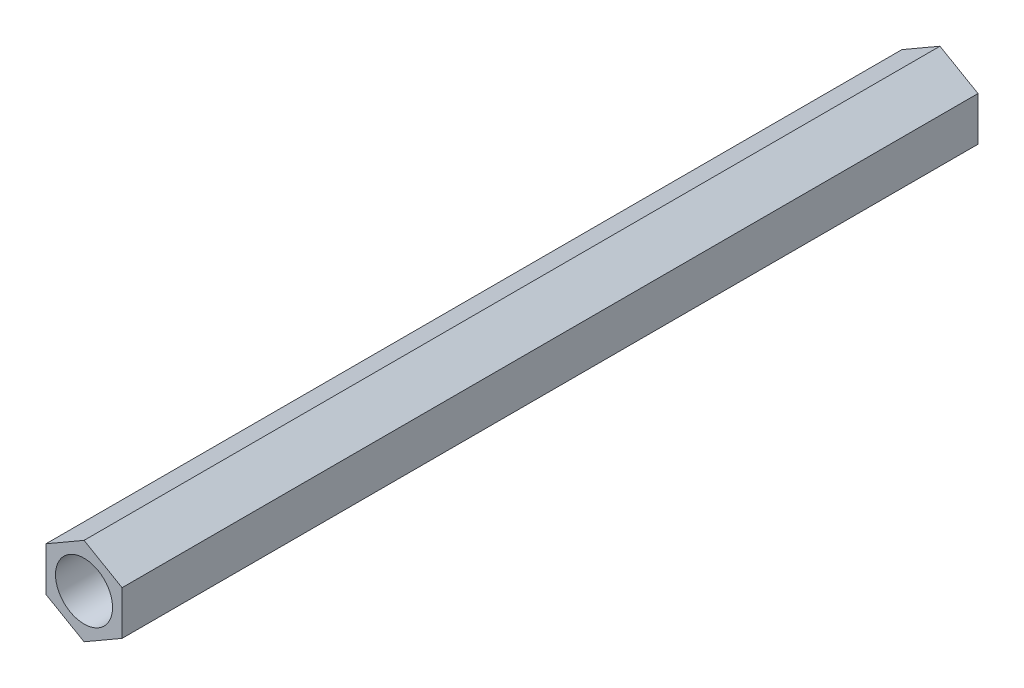
ISO-10303-21;
HEADER;
FILE_DESCRIPTION(('STEP AP214'),'2;1');
FILE_NAME('part.step','',(''),(''),'','','');
FILE_SCHEMA(('AUTOMOTIVE_DESIGN { 1 0 10303 214 1 1 1 1 }'));
ENDSEC;
DATA;
#1=APPLICATION_CONTEXT('core data for automotive mechanical design processes');
#2=APPLICATION_PROTOCOL_DEFINITION('international standard','automotive_design',2000,#1);
#3=PRODUCT_CONTEXT('',#1,'mechanical');
#4=PRODUCT('Part','Part','',(#3));
#5=PRODUCT_RELATED_PRODUCT_CATEGORY('part','',(#4));
#6=PRODUCT_DEFINITION_FORMATION('','',#4);
#7=PRODUCT_DEFINITION_CONTEXT('part definition',#1,'design');
#8=PRODUCT_DEFINITION('design','',#6,#7);
#9=PRODUCT_DEFINITION_SHAPE('','',#8);
#10=(LENGTH_UNIT() NAMED_UNIT(*) SI_UNIT(.MILLI.,.METRE.));
#11=(NAMED_UNIT(*) PLANE_ANGLE_UNIT() SI_UNIT($,.RADIAN.));
#12=(NAMED_UNIT(*) SI_UNIT($,.STERADIAN.) SOLID_ANGLE_UNIT());
#13=UNCERTAINTY_MEASURE_WITH_UNIT(LENGTH_MEASURE(1.E-05),#10,'distance_accuracy_value','');
#14=(GEOMETRIC_REPRESENTATION_CONTEXT(3) GLOBAL_UNCERTAINTY_ASSIGNED_CONTEXT((#13)) GLOBAL_UNIT_ASSIGNED_CONTEXT((#10,
#11,#12)) REPRESENTATION_CONTEXT('',''));
#15=CARTESIAN_POINT('',(0.,0.,0.));
#16=DIRECTION('',(0.,0.,1.));
#17=DIRECTION('',(1.,0.,0.));
#18=AXIS2_PLACEMENT_3D('',#15,#16,#17);
#19=CARTESIAN_POINT('',(0.,0.,90.));
#20=DIRECTION('',(0.,0.,1.));
#21=DIRECTION('',(1.,0.,0.));
#22=AXIS2_PLACEMENT_3D('',#19,#20,#21);
#23=PLANE('',#22);
#24=DIRECTION('',(0.866025403784439,0.5,0.));
#25=VECTOR('',#24,1.);
#26=CARTESIAN_POINT('',(0.,-4.618802153517,90.));
#27=LINE('',#26,#25);
#28=CARTESIAN_POINT('',(0.,-4.618802153517,90.));
#29=VERTEX_POINT('',#28);
#30=CARTESIAN_POINT('',(4.,-2.3094010767585,90.));
#31=VERTEX_POINT('',#30);
#32=EDGE_CURVE('E85',#29,#31,#27,.T.);
#33=ORIENTED_EDGE('',*,*,#32,.T.);
#34=DIRECTION('',(0.,1.,0.));
#35=VECTOR('',#34,1.);
#36=CARTESIAN_POINT('',(4.,-2.3094010767585,90.));
#37=LINE('',#36,#35);
#38=CARTESIAN_POINT('',(4.,2.3094010767585,90.));
#39=VERTEX_POINT('',#38);
#40=EDGE_CURVE('E99',#31,#39,#37,.T.);
#41=ORIENTED_EDGE('',*,*,#40,.T.);
#42=DIRECTION('',(-0.866025403784439,0.5,0.));
#43=VECTOR('',#42,1.);
#44=CARTESIAN_POINT('',(4.,2.3094010767585,90.));
#45=LINE('',#44,#43);
#46=CARTESIAN_POINT('',(0.,4.61880215351701,90.));
#47=VERTEX_POINT('',#46);
#48=EDGE_CURVE('E103',#39,#47,#45,.T.);
#49=ORIENTED_EDGE('',*,*,#48,.T.);
#50=DIRECTION('',(-0.866025403784439,-0.5,0.));
#51=VECTOR('',#50,1.);
#52=CARTESIAN_POINT('',(0.,4.61880215351701,90.));
#53=LINE('',#52,#51);
#54=CARTESIAN_POINT('',(-4.,2.3094010767585,90.));
#55=VERTEX_POINT('',#54);
#56=EDGE_CURVE('E114',#47,#55,#53,.T.);
#57=ORIENTED_EDGE('',*,*,#56,.T.);
#58=DIRECTION('',(0.,-1.,0.));
#59=VECTOR('',#58,1.);
#60=CARTESIAN_POINT('',(-4.,2.3094010767585,90.));
#61=LINE('',#60,#59);
#62=CARTESIAN_POINT('',(-4.,-2.3094010767585,90.));
#63=VERTEX_POINT('',#62);
#64=EDGE_CURVE('E116',#55,#63,#61,.T.);
#65=ORIENTED_EDGE('',*,*,#64,.T.);
#66=DIRECTION('',(0.866025403784439,-0.5,0.));
#67=VECTOR('',#66,1.);
#68=CARTESIAN_POINT('',(-4.,-2.3094010767585,90.));
#69=LINE('',#68,#67);
#70=EDGE_CURVE('E121',#63,#29,#69,.T.);
#71=ORIENTED_EDGE('',*,*,#70,.T.);
#72=EDGE_LOOP('',(#33,#41,#49,#57,#65,#71));
#73=FACE_BOUND('',#72,.T.);
#74=CARTESIAN_POINT('',(0.,0.,90.));
#75=DIRECTION('',(0.,0.,1.));
#76=DIRECTION('',(1.,0.,0.));
#77=AXIS2_PLACEMENT_3D('',#74,#75,#76);
#78=CIRCLE('',#77,3.);
#79=CARTESIAN_POINT('',(-3.,0.,90.));
#80=VERTEX_POINT('',#79);
#81=EDGE_CURVE('E11',#80,#80,#78,.T.);
#82=ORIENTED_EDGE('',*,*,#81,.F.);
#83=EDGE_LOOP('',(#82));
#84=FACE_BOUND('',#83,.T.);
#85=ADVANCED_FACE('F35',(#73,#84),#23,.T.);
#86=CARTESIAN_POINT('',(0.,0.,0.));
#87=DIRECTION('',(0.,0.,1.));
#88=DIRECTION('',(1.,0.,0.));
#89=AXIS2_PLACEMENT_3D('',#86,#87,#88);
#90=PLANE('',#89);
#91=DIRECTION('',(0.866025403784439,0.5,0.));
#92=VECTOR('',#91,1.);
#93=CARTESIAN_POINT('',(0.,4.61880215351701,0.));
#94=LINE('',#93,#92);
#95=CARTESIAN_POINT('',(-4.,2.3094010767585,0.));
#96=VERTEX_POINT('',#95);
#97=CARTESIAN_POINT('',(0.,4.61880215351701,0.));
#98=VERTEX_POINT('',#97);
#99=EDGE_CURVE('E68',#96,#98,#94,.T.);
#100=ORIENTED_EDGE('',*,*,#99,.T.);
#101=DIRECTION('',(0.866025403784439,-0.5,0.));
#102=VECTOR('',#101,1.);
#103=CARTESIAN_POINT('',(4.,2.3094010767585,0.));
#104=LINE('',#103,#102);
#105=CARTESIAN_POINT('',(4.,2.3094010767585,0.));
#106=VERTEX_POINT('',#105);
#107=EDGE_CURVE('E73',#98,#106,#104,.T.);
#108=ORIENTED_EDGE('',*,*,#107,.T.);
#109=DIRECTION('',(0.,-1.,0.));
#110=VECTOR('',#109,1.);
#111=CARTESIAN_POINT('',(4.,-2.3094010767585,0.));
#112=LINE('',#111,#110);
#113=CARTESIAN_POINT('',(4.,-2.3094010767585,0.));
#114=VERTEX_POINT('',#113);
#115=EDGE_CURVE('E109',#106,#114,#112,.T.);
#116=ORIENTED_EDGE('',*,*,#115,.T.);
#117=DIRECTION('',(-0.866025403784439,-0.5,0.));
#118=VECTOR('',#117,1.);
#119=CARTESIAN_POINT('',(0.,-4.618802153517,0.));
#120=LINE('',#119,#118);
#121=CARTESIAN_POINT('',(0.,-4.618802153517,0.));
#122=VERTEX_POINT('',#121);
#123=EDGE_CURVE('E52',#114,#122,#120,.T.);
#124=ORIENTED_EDGE('',*,*,#123,.T.);
#125=DIRECTION('',(-0.866025403784439,0.5,0.));
#126=VECTOR('',#125,1.);
#127=CARTESIAN_POINT('',(-4.,-2.3094010767585,0.));
#128=LINE('',#127,#126);
#129=CARTESIAN_POINT('',(-4.,-2.3094010767585,0.));
#130=VERTEX_POINT('',#129);
#131=EDGE_CURVE('E144',#122,#130,#128,.T.);
#132=ORIENTED_EDGE('',*,*,#131,.T.);
#133=DIRECTION('',(0.,1.,0.));
#134=VECTOR('',#133,1.);
#135=CARTESIAN_POINT('',(-4.,2.3094010767585,0.));
#136=LINE('',#135,#134);
#137=EDGE_CURVE('E232',#130,#96,#136,.T.);
#138=ORIENTED_EDGE('',*,*,#137,.T.);
#139=EDGE_LOOP('',(#100,#108,#116,#124,#132,#138));
#140=FACE_BOUND('',#139,.T.);
#141=CARTESIAN_POINT('',(0.,0.,0.));
#142=DIRECTION('',(0.,0.,1.));
#143=DIRECTION('',(1.,0.,0.));
#144=AXIS2_PLACEMENT_3D('',#141,#142,#143);
#145=CIRCLE('',#144,3.);
#146=CARTESIAN_POINT('',(-3.,0.,0.));
#147=VERTEX_POINT('',#146);
#148=EDGE_CURVE('E39',#147,#147,#145,.T.);
#149=ORIENTED_EDGE('',*,*,#148,.T.);
#150=EDGE_LOOP('',(#149));
#151=FACE_BOUND('',#150,.T.);
#152=ADVANCED_FACE('F37',(#140,#151),#90,.F.);
#153=CARTESIAN_POINT('',(0.,0.,90.));
#154=DIRECTION('',(0.,0.,-1.));
#155=DIRECTION('',(-1.,0.,0.));
#156=AXIS2_PLACEMENT_3D('',#153,#154,#155);
#157=CYLINDRICAL_SURFACE('',#156,3.);
#158=CARTESIAN_POINT('',(-3.,0.,90.));
#159=CARTESIAN_POINT('',(-3.,0.,89.0625));
#160=CARTESIAN_POINT('',(-3.,0.,88.125));
#161=CARTESIAN_POINT('',(-3.,0.,86.25));
#162=CARTESIAN_POINT('',(-3.,0.,85.3125));
#163=CARTESIAN_POINT('',(-3.,0.,83.4375));
#164=CARTESIAN_POINT('',(-3.,0.,82.5));
#165=CARTESIAN_POINT('',(-3.,0.,80.625));
#166=CARTESIAN_POINT('',(-3.,0.,79.6875));
#167=CARTESIAN_POINT('',(-3.,0.,77.8125));
#168=CARTESIAN_POINT('',(-3.,0.,76.875));
#169=CARTESIAN_POINT('',(-3.,0.,75.));
#170=CARTESIAN_POINT('',(-3.,0.,74.0625));
#171=CARTESIAN_POINT('',(-3.,0.,72.1875));
#172=CARTESIAN_POINT('',(-3.,0.,71.25));
#173=CARTESIAN_POINT('',(-3.,0.,69.375));
#174=CARTESIAN_POINT('',(-3.,0.,68.4375));
#175=CARTESIAN_POINT('',(-3.,0.,66.5625));
#176=CARTESIAN_POINT('',(-3.,0.,65.625));
#177=CARTESIAN_POINT('',(-3.,0.,63.75));
#178=CARTESIAN_POINT('',(-3.,0.,62.8125));
#179=CARTESIAN_POINT('',(-3.,0.,60.9375));
#180=CARTESIAN_POINT('',(-3.,0.,60.));
#181=CARTESIAN_POINT('',(-3.,0.,58.125));
#182=CARTESIAN_POINT('',(-3.,0.,57.1875));
#183=CARTESIAN_POINT('',(-3.,0.,55.3125));
#184=CARTESIAN_POINT('',(-3.,0.,54.375));
#185=CARTESIAN_POINT('',(-3.,0.,52.5));
#186=CARTESIAN_POINT('',(-3.,0.,51.5625));
#187=CARTESIAN_POINT('',(-3.,0.,49.6875));
#188=CARTESIAN_POINT('',(-3.,0.,48.75));
#189=CARTESIAN_POINT('',(-3.,0.,46.875));
#190=CARTESIAN_POINT('',(-3.,0.,45.9375));
#191=CARTESIAN_POINT('',(-3.,0.,44.0625));
#192=CARTESIAN_POINT('',(-3.,0.,43.125));
#193=CARTESIAN_POINT('',(-3.,0.,41.25));
#194=CARTESIAN_POINT('',(-3.,0.,40.3125));
#195=CARTESIAN_POINT('',(-3.,0.,38.4375));
#196=CARTESIAN_POINT('',(-3.,0.,37.5));
#197=CARTESIAN_POINT('',(-3.,0.,35.625));
#198=CARTESIAN_POINT('',(-3.,0.,34.6875));
#199=CARTESIAN_POINT('',(-3.,0.,32.8125));
#200=CARTESIAN_POINT('',(-3.,0.,31.875));
#201=CARTESIAN_POINT('',(-3.,0.,30.));
#202=CARTESIAN_POINT('',(-3.,0.,29.0625));
#203=CARTESIAN_POINT('',(-3.,0.,27.1875));
#204=CARTESIAN_POINT('',(-3.,0.,26.25));
#205=CARTESIAN_POINT('',(-3.,0.,24.375));
#206=CARTESIAN_POINT('',(-3.,0.,23.4375));
#207=CARTESIAN_POINT('',(-3.,0.,21.5625));
#208=CARTESIAN_POINT('',(-3.,0.,20.625));
#209=CARTESIAN_POINT('',(-3.,0.,18.75));
#210=CARTESIAN_POINT('',(-3.,0.,17.8125));
#211=CARTESIAN_POINT('',(-3.,0.,15.9375));
#212=CARTESIAN_POINT('',(-3.,0.,15.));
#213=CARTESIAN_POINT('',(-3.,0.,13.125));
#214=CARTESIAN_POINT('',(-3.,0.,12.1875));
#215=CARTESIAN_POINT('',(-3.,0.,10.3125));
#216=CARTESIAN_POINT('',(-3.,0.,9.37499999999999));
#217=CARTESIAN_POINT('',(-3.,0.,7.49999999999999));
#218=CARTESIAN_POINT('',(-3.,0.,6.56249999999999));
#219=CARTESIAN_POINT('',(-3.,0.,4.68749999999999));
#220=CARTESIAN_POINT('',(-3.,0.,3.74999999999998));
#221=CARTESIAN_POINT('',(-3.,0.,1.87499999999998));
#222=CARTESIAN_POINT('',(-3.,0.,0.937499999999986));
#223=CARTESIAN_POINT('',(-3.,0.,0.));
#224=B_SPLINE_CURVE_WITH_KNOTS('',3,(#158,#159,#160,#161,#162,#163,#164,#165,#166,#167,#168,
#169,#170,#171,#172,#173,#174,#175,#176,#177,#178,#179,#180,#181,#182,#183,#184,#185,#186,#187,
#188,#189,#190,#191,#192,#193,#194,#195,#196,#197,#198,#199,#200,#201,#202,#203,#204,#205,#206,
#207,#208,#209,#210,#211,#212,#213,#214,#215,#216,#217,#218,#219,#220,#221,#222,#223),
.UNSPECIFIED.,.F.,.F.,(4,2,2,2,2,2,2,2,2,2,2,2,2,2,2,2,2,2,2,2,2,2,2,2,2,2,2,2,2,2,2,2,4),(0.,
2.8125,5.62499999999999,8.43749999999999,11.25,14.0625,16.875,19.6875,22.5,25.3125,28.125,
30.9375,33.75,36.5625,39.375,42.1875,45.,47.8125,50.625,53.4375,56.25,59.0625,61.875,64.6875,
67.5,70.3125,73.125,75.9375,78.75,81.5625,84.375,87.1875,90.),.UNSPECIFIED.);
#225=EDGE_CURVE('BSEAM159',#80,#147,#224,.T.);
#226=ORIENTED_EDGE('',*,*,#81,.T.);
#227=ORIENTED_EDGE('',*,*,#148,.F.);
#228=ORIENTED_EDGE('',*,*,#225,.T.);
#229=ORIENTED_EDGE('',*,*,#225,.F.);
#230=EDGE_LOOP('',(#226,#228,#227,#229));
#231=FACE_BOUND('',#230,.T.);
#232=ADVANCED_FACE('F159',(#231),#157,.F.);
#233=CARTESIAN_POINT('',(4.,2.3094010767585,-12.2202018532156));
#234=DIRECTION('',(0.5,0.866025403784439,0.));
#235=DIRECTION('',(-0.866025403784439,0.5,0.));
#236=AXIS2_PLACEMENT_3D('',#233,#234,#235);
#237=PLANE('',#236);
#238=ORIENTED_EDGE('',*,*,#107,.F.);
#239=DIRECTION('',(0.,0.,1.));
#240=VECTOR('',#239,1.);
#241=CARTESIAN_POINT('',(0.,4.61880215351701,-12.2202018532156));
#242=LINE('',#241,#240);
#243=EDGE_CURVE('E110',#98,#47,#242,.T.);
#244=ORIENTED_EDGE('',*,*,#243,.T.);
#245=ORIENTED_EDGE('',*,*,#48,.F.);
#246=DIRECTION('',(0.,0.,1.));
#247=VECTOR('',#246,1.);
#248=CARTESIAN_POINT('',(4.,2.3094010767585,-12.2202018532156));
#249=LINE('',#248,#247);
#250=EDGE_CURVE('E107',#106,#39,#249,.T.);
#251=ORIENTED_EDGE('',*,*,#250,.F.);
#252=EDGE_LOOP('',(#238,#244,#245,#251));
#253=FACE_BOUND('',#252,.T.);
#254=ADVANCED_FACE('F112',(#253),#237,.T.);
#255=CARTESIAN_POINT('',(0.,4.61880215351701,-12.2202018532156));
#256=DIRECTION('',(-0.5,0.866025403784439,0.));
#257=DIRECTION('',(-0.866025403784439,-0.5,0.));
#258=AXIS2_PLACEMENT_3D('',#255,#256,#257);
#259=PLANE('',#258);
#260=ORIENTED_EDGE('',*,*,#99,.F.);
#261=DIRECTION('',(0.,0.,1.));
#262=VECTOR('',#261,1.);
#263=CARTESIAN_POINT('',(-4.,2.3094010767585,-12.2202018532156));
#264=LINE('',#263,#262);
#265=EDGE_CURVE('E132',#96,#55,#264,.T.);
#266=ORIENTED_EDGE('',*,*,#265,.T.);
#267=ORIENTED_EDGE('',*,*,#56,.F.);
#268=ORIENTED_EDGE('',*,*,#243,.F.);
#269=EDGE_LOOP('',(#260,#266,#267,#268));
#270=FACE_BOUND('',#269,.T.);
#271=ADVANCED_FACE('F136',(#270),#259,.T.);
#272=CARTESIAN_POINT('',(-4.,2.3094010767585,-12.2202018532156));
#273=DIRECTION('',(-1.,0.,0.));
#274=DIRECTION('',(0.,-1.,0.));
#275=AXIS2_PLACEMENT_3D('',#272,#273,#274);
#276=PLANE('',#275);
#277=ORIENTED_EDGE('',*,*,#137,.F.);
#278=DIRECTION('',(0.,0.,1.));
#279=VECTOR('',#278,1.);
#280=CARTESIAN_POINT('',(-4.,-2.3094010767585,-12.2202018532156));
#281=LINE('',#280,#279);
#282=EDGE_CURVE('E129',#130,#63,#281,.T.);
#283=ORIENTED_EDGE('',*,*,#282,.T.);
#284=ORIENTED_EDGE('',*,*,#64,.F.);
#285=ORIENTED_EDGE('',*,*,#265,.F.);
#286=EDGE_LOOP('',(#277,#283,#284,#285));
#287=FACE_BOUND('',#286,.T.);
#288=ADVANCED_FACE('F138',(#287),#276,.T.);
#289=CARTESIAN_POINT('',(-4.,-2.3094010767585,-12.2202018532156));
#290=DIRECTION('',(-0.5,-0.866025403784439,0.));
#291=DIRECTION('',(0.866025403784439,-0.5,0.));
#292=AXIS2_PLACEMENT_3D('',#289,#290,#291);
#293=PLANE('',#292);
#294=ORIENTED_EDGE('',*,*,#131,.F.);
#295=DIRECTION('',(0.,0.,1.));
#296=VECTOR('',#295,1.);
#297=CARTESIAN_POINT('',(0.,-4.618802153517,-12.2202018532156));
#298=LINE('',#297,#296);
#299=EDGE_CURVE('E126',#122,#29,#298,.T.);
#300=ORIENTED_EDGE('',*,*,#299,.T.);
#301=ORIENTED_EDGE('',*,*,#70,.F.);
#302=ORIENTED_EDGE('',*,*,#282,.F.);
#303=EDGE_LOOP('',(#294,#300,#301,#302));
#304=FACE_BOUND('',#303,.T.);
#305=ADVANCED_FACE('F142',(#304),#293,.T.);
#306=CARTESIAN_POINT('',(0.,-4.618802153517,-12.2202018532156));
#307=DIRECTION('',(0.5,-0.866025403784439,0.));
#308=DIRECTION('',(0.866025403784439,0.5,0.));
#309=AXIS2_PLACEMENT_3D('',#306,#307,#308);
#310=PLANE('',#309);
#311=ORIENTED_EDGE('',*,*,#123,.F.);
#312=DIRECTION('',(0.,0.,1.));
#313=VECTOR('',#312,1.);
#314=CARTESIAN_POINT('',(4.,-2.3094010767585,-12.2202018532156));
#315=LINE('',#314,#313);
#316=EDGE_CURVE('E124',#114,#31,#315,.T.);
#317=ORIENTED_EDGE('',*,*,#316,.T.);
#318=ORIENTED_EDGE('',*,*,#32,.F.);
#319=ORIENTED_EDGE('',*,*,#299,.F.);
#320=EDGE_LOOP('',(#311,#317,#318,#319));
#321=FACE_BOUND('',#320,.T.);
#322=ADVANCED_FACE('F145',(#321),#310,.T.);
#323=CARTESIAN_POINT('',(4.,-2.3094010767585,-12.2202018532156));
#324=DIRECTION('',(1.,0.,0.));
#325=DIRECTION('',(0.,1.,0.));
#326=AXIS2_PLACEMENT_3D('',#323,#324,#325);
#327=PLANE('',#326);
#328=ORIENTED_EDGE('',*,*,#316,.F.);
#329=ORIENTED_EDGE('',*,*,#115,.F.);
#330=ORIENTED_EDGE('',*,*,#250,.T.);
#331=ORIENTED_EDGE('',*,*,#40,.F.);
#332=EDGE_LOOP('',(#328,#329,#330,#331));
#333=FACE_BOUND('',#332,.T.);
#334=ADVANCED_FACE('F108',(#333),#327,.T.);
#335=CLOSED_SHELL('',(#85,#152,#232,#254,#271,#288,#305,#322,#334));
#336=MANIFOLD_SOLID_BREP('B2',#335);
#337=ADVANCED_BREP_SHAPE_REPRESENTATION('',(#18,#336),#14);
#338=SHAPE_DEFINITION_REPRESENTATION(#9,#337);
ENDSEC;
END-ISO-10303-21;
